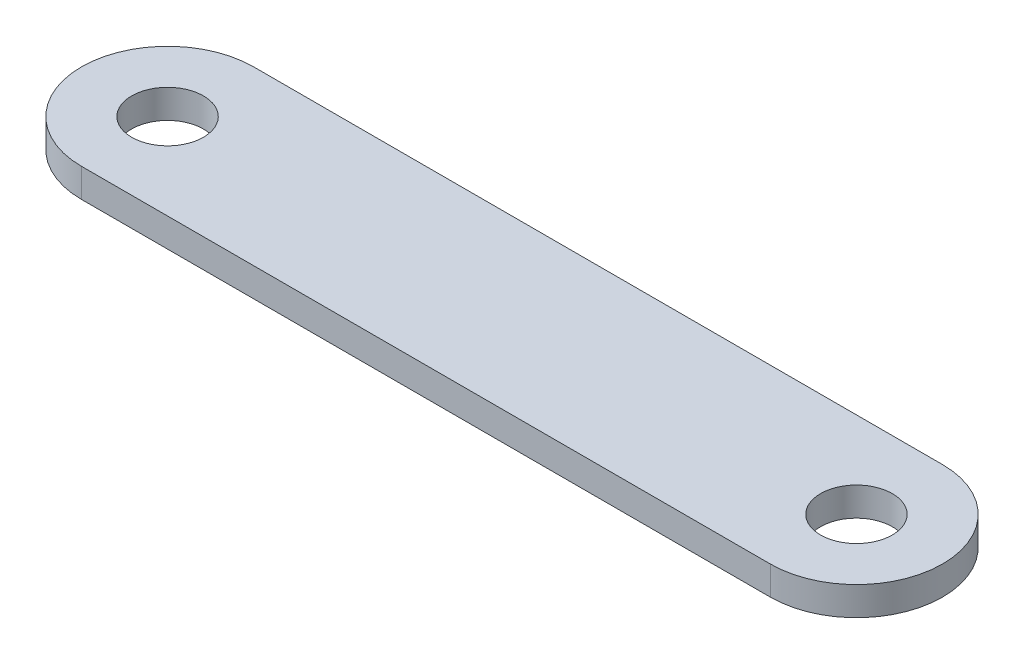
ISO-10303-21;
HEADER;
FILE_DESCRIPTION(('STEP AP214'),'2;1');
FILE_NAME('part.step','',(''),(''),'','','');
FILE_SCHEMA(('AUTOMOTIVE_DESIGN { 1 0 10303 214 1 1 1 1 }'));
ENDSEC;
DATA;
#1=APPLICATION_CONTEXT('core data for automotive mechanical design processes');
#2=APPLICATION_PROTOCOL_DEFINITION('international standard','automotive_design',2000,#1);
#3=PRODUCT_CONTEXT('',#1,'mechanical');
#4=PRODUCT('Part','Part','',(#3));
#5=PRODUCT_RELATED_PRODUCT_CATEGORY('part','',(#4));
#6=PRODUCT_DEFINITION_FORMATION('','',#4);
#7=PRODUCT_DEFINITION_CONTEXT('part definition',#1,'design');
#8=PRODUCT_DEFINITION('design','',#6,#7);
#9=PRODUCT_DEFINITION_SHAPE('','',#8);
#10=(LENGTH_UNIT() NAMED_UNIT(*) SI_UNIT(.MILLI.,.METRE.));
#11=(NAMED_UNIT(*) PLANE_ANGLE_UNIT() SI_UNIT($,.RADIAN.));
#12=(NAMED_UNIT(*) SI_UNIT($,.STERADIAN.) SOLID_ANGLE_UNIT());
#13=UNCERTAINTY_MEASURE_WITH_UNIT(LENGTH_MEASURE(1.E-05),#10,'distance_accuracy_value','');
#14=(GEOMETRIC_REPRESENTATION_CONTEXT(3) GLOBAL_UNCERTAINTY_ASSIGNED_CONTEXT((#13)) GLOBAL_UNIT_ASSIGNED_CONTEXT((#10,
#11,#12)) REPRESENTATION_CONTEXT('',''));
#15=CARTESIAN_POINT('',(0.,0.,0.));
#16=DIRECTION('',(0.,0.,1.));
#17=DIRECTION('',(1.,0.,0.));
#18=AXIS2_PLACEMENT_3D('',#15,#16,#17);
#19=CARTESIAN_POINT('',(-38.1,1.5875,0.));
#20=DIRECTION('',(0.,1.,0.));
#21=DIRECTION('',(0.,0.,1.));
#22=AXIS2_PLACEMENT_3D('',#19,#20,#21);
#23=PLANE('',#22);
#24=CARTESIAN_POINT('',(38.1,1.5875,0.));
#25=DIRECTION('',(0.,1.,0.));
#26=DIRECTION('',(0.,0.,1.));
#27=AXIS2_PLACEMENT_3D('',#24,#25,#26);
#28=CIRCLE('',#27,3.96875);
#29=CARTESIAN_POINT('',(38.1,1.5875,3.96874999999998));
#30=VERTEX_POINT('',#29);
#31=EDGE_CURVE('E101',#30,#30,#28,.T.);
#32=ORIENTED_EDGE('',*,*,#31,.F.);
#33=EDGE_LOOP('',(#32));
#34=FACE_BOUND('',#33,.T.);
#35=CARTESIAN_POINT('',(-38.1,1.5875,0.));
#36=DIRECTION('',(0.,1.,0.));
#37=DIRECTION('',(0.,0.,1.));
#38=AXIS2_PLACEMENT_3D('',#35,#36,#37);
#39=CIRCLE('',#38,9.52500000000001);
#40=CARTESIAN_POINT('',(-38.1,1.5875,-9.52500000000001));
#41=VERTEX_POINT('',#40);
#42=CARTESIAN_POINT('',(-38.1,1.5875,9.52500000000001));
#43=VERTEX_POINT('',#42);
#44=EDGE_CURVE('E86',#41,#43,#39,.T.);
#45=ORIENTED_EDGE('',*,*,#44,.T.);
#46=DIRECTION('',(1.,0.,0.));
#47=VECTOR('',#46,1.);
#48=CARTESIAN_POINT('',(-38.1,1.5875,9.52500000000001));
#49=LINE('',#48,#47);
#50=CARTESIAN_POINT('',(38.1,1.5875,9.525));
#51=VERTEX_POINT('',#50);
#52=EDGE_CURVE('E81',#43,#51,#49,.T.);
#53=ORIENTED_EDGE('',*,*,#52,.T.);
#54=CARTESIAN_POINT('',(38.1,1.5875,0.));
#55=DIRECTION('',(0.,1.,0.));
#56=DIRECTION('',(0.,0.,1.));
#57=AXIS2_PLACEMENT_3D('',#54,#55,#56);
#58=CIRCLE('',#57,9.52500000000001);
#59=CARTESIAN_POINT('',(38.1,1.5875,-9.52500000000003));
#60=VERTEX_POINT('',#59);
#61=EDGE_CURVE('E84',#51,#60,#58,.T.);
#62=ORIENTED_EDGE('',*,*,#61,.T.);
#63=DIRECTION('',(-1.,0.,0.));
#64=VECTOR('',#63,1.);
#65=CARTESIAN_POINT('',(-38.1,1.5875,-9.52500000000001));
#66=LINE('',#65,#64);
#67=EDGE_CURVE('E51',#60,#41,#66,.T.);
#68=ORIENTED_EDGE('',*,*,#67,.T.);
#69=EDGE_LOOP('',(#45,#53,#62,#68));
#70=FACE_BOUND('',#69,.T.);
#71=CARTESIAN_POINT('',(-38.1,1.5875,0.));
#72=DIRECTION('',(0.,1.,0.));
#73=DIRECTION('',(0.,0.,1.));
#74=AXIS2_PLACEMENT_3D('',#71,#72,#73);
#75=CIRCLE('',#74,3.96875);
#76=CARTESIAN_POINT('',(-38.1,1.5875,3.96875));
#77=VERTEX_POINT('',#76);
#78=EDGE_CURVE('E116',#77,#77,#75,.T.);
#79=ORIENTED_EDGE('',*,*,#78,.F.);
#80=EDGE_LOOP('',(#79));
#81=FACE_BOUND('',#80,.T.);
#82=ADVANCED_FACE('F34',(#34,#70,#81),#23,.T.);
#83=CARTESIAN_POINT('',(-38.1,-1.5875,0.));
#84=DIRECTION('',(0.,1.,0.));
#85=DIRECTION('',(0.,0.,1.));
#86=AXIS2_PLACEMENT_3D('',#83,#84,#85);
#87=PLANE('',#86);
#88=CARTESIAN_POINT('',(-38.1,-1.5875,0.));
#89=DIRECTION('',(0.,1.,0.));
#90=DIRECTION('',(0.,0.,1.));
#91=AXIS2_PLACEMENT_3D('',#88,#89,#90);
#92=CIRCLE('',#91,9.52500000000001);
#93=CARTESIAN_POINT('',(-38.1,-1.5875,-9.52500000000001));
#94=VERTEX_POINT('',#93);
#95=CARTESIAN_POINT('',(-38.1,-1.5875,9.52500000000001));
#96=VERTEX_POINT('',#95);
#97=EDGE_CURVE('E98',#94,#96,#92,.T.);
#98=ORIENTED_EDGE('',*,*,#97,.F.);
#99=DIRECTION('',(-1.,0.,0.));
#100=VECTOR('',#99,1.);
#101=CARTESIAN_POINT('',(-38.1,-1.5875,-9.52500000000001));
#102=LINE('',#101,#100);
#103=CARTESIAN_POINT('',(38.1,-1.5875,-9.52500000000003));
#104=VERTEX_POINT('',#103);
#105=EDGE_CURVE('E74',#104,#94,#102,.T.);
#106=ORIENTED_EDGE('',*,*,#105,.F.);
#107=CARTESIAN_POINT('',(38.1,-1.5875,0.));
#108=DIRECTION('',(0.,1.,0.));
#109=DIRECTION('',(0.,0.,1.));
#110=AXIS2_PLACEMENT_3D('',#107,#108,#109);
#111=CIRCLE('',#110,9.52500000000001);
#112=CARTESIAN_POINT('',(38.1,-1.5875,9.525));
#113=VERTEX_POINT('',#112);
#114=EDGE_CURVE('E68',#113,#104,#111,.T.);
#115=ORIENTED_EDGE('',*,*,#114,.F.);
#116=DIRECTION('',(1.,0.,0.));
#117=VECTOR('',#116,1.);
#118=CARTESIAN_POINT('',(-38.1,-1.5875,9.52500000000001));
#119=LINE('',#118,#117);
#120=EDGE_CURVE('E90',#96,#113,#119,.T.);
#121=ORIENTED_EDGE('',*,*,#120,.F.);
#122=EDGE_LOOP('',(#98,#106,#115,#121));
#123=FACE_BOUND('',#122,.T.);
#124=CARTESIAN_POINT('',(38.1,-1.5875,0.));
#125=DIRECTION('',(0.,1.,0.));
#126=DIRECTION('',(0.,0.,1.));
#127=AXIS2_PLACEMENT_3D('',#124,#125,#126);
#128=CIRCLE('',#127,3.96875);
#129=CARTESIAN_POINT('',(38.1,-1.5875,3.96874999999998));
#130=VERTEX_POINT('',#129);
#131=EDGE_CURVE('E113',#130,#130,#128,.T.);
#132=ORIENTED_EDGE('',*,*,#131,.T.);
#133=EDGE_LOOP('',(#132));
#134=FACE_BOUND('',#133,.T.);
#135=CARTESIAN_POINT('',(-38.1,-1.5875,0.));
#136=DIRECTION('',(0.,1.,0.));
#137=DIRECTION('',(0.,0.,1.));
#138=AXIS2_PLACEMENT_3D('',#135,#136,#137);
#139=CIRCLE('',#138,3.96875);
#140=CARTESIAN_POINT('',(-38.1,-1.5875,3.96875));
#141=VERTEX_POINT('',#140);
#142=EDGE_CURVE('E119',#141,#141,#139,.T.);
#143=ORIENTED_EDGE('',*,*,#142,.T.);
#144=EDGE_LOOP('',(#143));
#145=FACE_BOUND('',#144,.T.);
#146=ADVANCED_FACE('F109',(#123,#134,#145),#87,.F.);
#147=CARTESIAN_POINT('',(-38.1,1.5875,0.));
#148=DIRECTION('',(0.,-1.,0.));
#149=DIRECTION('',(0.,0.,-1.));
#150=AXIS2_PLACEMENT_3D('',#147,#148,#149);
#151=CYLINDRICAL_SURFACE('',#150,9.52500000000001);
#152=ORIENTED_EDGE('',*,*,#97,.T.);
#153=DIRECTION('',(0.,-1.,0.));
#154=VECTOR('',#153,1.);
#155=CARTESIAN_POINT('',(-38.1,1.5875,9.52500000000001));
#156=LINE('',#155,#154);
#157=EDGE_CURVE('E11',#43,#96,#156,.T.);
#158=ORIENTED_EDGE('',*,*,#157,.F.);
#159=ORIENTED_EDGE('',*,*,#44,.F.);
#160=DIRECTION('',(0.,-1.,0.));
#161=VECTOR('',#160,1.);
#162=CARTESIAN_POINT('',(-38.1,1.5875,-9.52500000000001));
#163=LINE('',#162,#161);
#164=EDGE_CURVE('E94',#41,#94,#163,.T.);
#165=ORIENTED_EDGE('',*,*,#164,.T.);
#166=EDGE_LOOP('',(#152,#158,#159,#165));
#167=FACE_BOUND('',#166,.T.);
#168=ADVANCED_FACE('F36',(#167),#151,.T.);
#169=CARTESIAN_POINT('',(-38.1,1.5875,9.52500000000001));
#170=DIRECTION('',(0.,0.,-1.));
#171=DIRECTION('',(-1.,0.,0.));
#172=AXIS2_PLACEMENT_3D('',#169,#170,#171);
#173=PLANE('',#172);
#174=ORIENTED_EDGE('',*,*,#120,.T.);
#175=DIRECTION('',(0.,-1.,0.));
#176=VECTOR('',#175,1.);
#177=CARTESIAN_POINT('',(38.1,1.5875,9.525));
#178=LINE('',#177,#176);
#179=EDGE_CURVE('E43',#51,#113,#178,.T.);
#180=ORIENTED_EDGE('',*,*,#179,.F.);
#181=ORIENTED_EDGE('',*,*,#52,.F.);
#182=ORIENTED_EDGE('',*,*,#157,.T.);
#183=EDGE_LOOP('',(#174,#180,#181,#182));
#184=FACE_BOUND('',#183,.T.);
#185=ADVANCED_FACE('F89',(#184),#173,.F.);
#186=CARTESIAN_POINT('',(38.1,1.5875,0.));
#187=DIRECTION('',(0.,-1.,0.));
#188=DIRECTION('',(0.,0.,-1.));
#189=AXIS2_PLACEMENT_3D('',#186,#187,#188);
#190=CYLINDRICAL_SURFACE('',#189,9.52500000000001);
#191=ORIENTED_EDGE('',*,*,#114,.T.);
#192=DIRECTION('',(0.,-1.,0.));
#193=VECTOR('',#192,1.);
#194=CARTESIAN_POINT('',(38.1,1.5875,-9.52500000000003));
#195=LINE('',#194,#193);
#196=EDGE_CURVE('E91',#60,#104,#195,.T.);
#197=ORIENTED_EDGE('',*,*,#196,.F.);
#198=ORIENTED_EDGE('',*,*,#61,.F.);
#199=ORIENTED_EDGE('',*,*,#179,.T.);
#200=EDGE_LOOP('',(#191,#197,#198,#199));
#201=FACE_BOUND('',#200,.T.);
#202=ADVANCED_FACE('F92',(#201),#190,.T.);
#203=CARTESIAN_POINT('',(-38.1,1.5875,-9.52500000000001));
#204=DIRECTION('',(0.,0.,1.));
#205=DIRECTION('',(1.,0.,0.));
#206=AXIS2_PLACEMENT_3D('',#203,#204,#205);
#207=PLANE('',#206);
#208=ORIENTED_EDGE('',*,*,#105,.T.);
#209=ORIENTED_EDGE('',*,*,#164,.F.);
#210=ORIENTED_EDGE('',*,*,#67,.F.);
#211=ORIENTED_EDGE('',*,*,#196,.T.);
#212=EDGE_LOOP('',(#208,#209,#210,#211));
#213=FACE_BOUND('',#212,.T.);
#214=ADVANCED_FACE('F106',(#213),#207,.F.);
#215=CARTESIAN_POINT('',(38.1,1.5875,0.));
#216=DIRECTION('',(0.,-1.,0.));
#217=DIRECTION('',(0.,0.,-1.));
#218=AXIS2_PLACEMENT_3D('',#215,#216,#217);
#219=CYLINDRICAL_SURFACE('',#218,3.96875);
#220=ORIENTED_EDGE('',*,*,#31,.T.);
#221=EDGE_LOOP('',(#220));
#222=FACE_BOUND('',#221,.T.);
#223=ORIENTED_EDGE('',*,*,#131,.F.);
#224=EDGE_LOOP('',(#223));
#225=FACE_BOUND('',#224,.T.);
#226=ADVANCED_FACE('F136',(#222,#225),#219,.F.);
#227=CARTESIAN_POINT('',(-38.1,1.5875,0.));
#228=DIRECTION('',(0.,-1.,0.));
#229=DIRECTION('',(0.,0.,-1.));
#230=AXIS2_PLACEMENT_3D('',#227,#228,#229);
#231=CYLINDRICAL_SURFACE('',#230,3.96875);
#232=ORIENTED_EDGE('',*,*,#78,.T.);
#233=EDGE_LOOP('',(#232));
#234=FACE_BOUND('',#233,.T.);
#235=ORIENTED_EDGE('',*,*,#142,.F.);
#236=EDGE_LOOP('',(#235));
#237=FACE_BOUND('',#236,.T.);
#238=ADVANCED_FACE('F125',(#234,#237),#231,.F.);
#239=CLOSED_SHELL('',(#82,#146,#168,#185,#202,#214,#226,#238));
#240=MANIFOLD_SOLID_BREP('B2',#239);
#241=ADVANCED_BREP_SHAPE_REPRESENTATION('',(#18,#240),#14);
#242=SHAPE_DEFINITION_REPRESENTATION(#9,#241);
ENDSEC;
END-ISO-10303-21;
